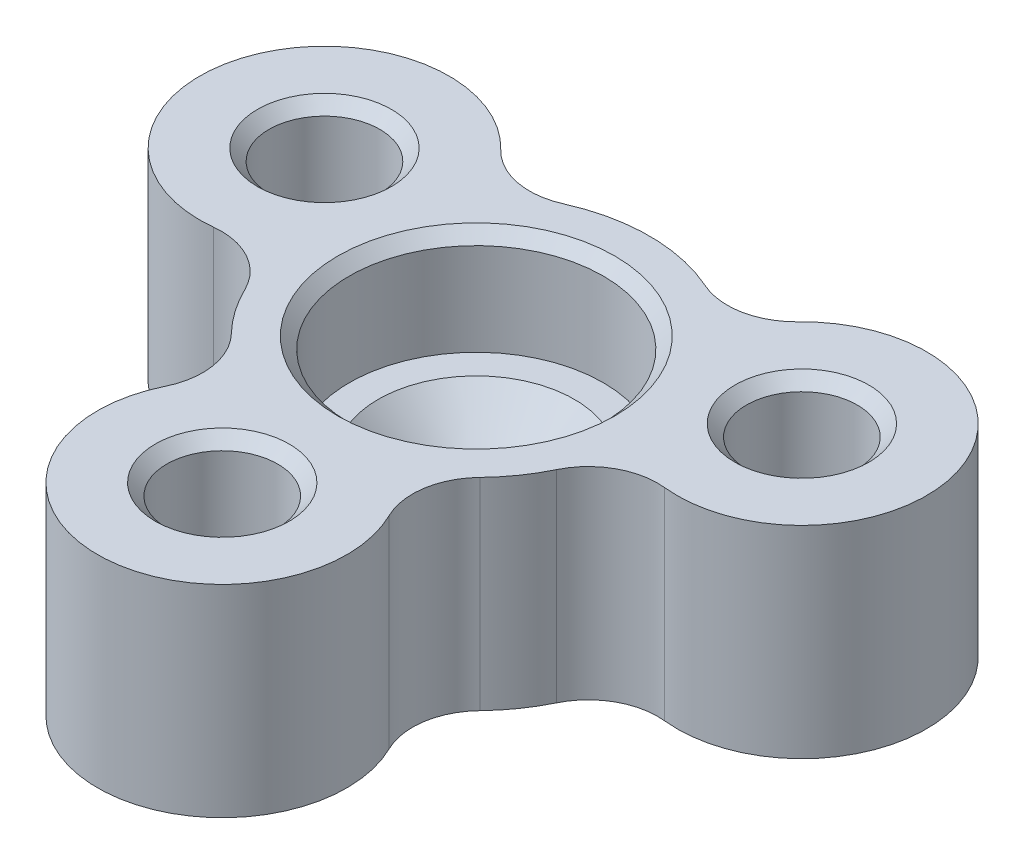
ISO-10303-21;
HEADER;
FILE_DESCRIPTION(('STEP AP214'),'2;1');
FILE_NAME('part.step','',(''),(''),'','','');
FILE_SCHEMA(('AUTOMOTIVE_DESIGN { 1 0 10303 214 1 1 1 1 }'));
ENDSEC;
DATA;
#1=APPLICATION_CONTEXT('core data for automotive mechanical design processes');
#2=APPLICATION_PROTOCOL_DEFINITION('international standard','automotive_design',2000,#1);
#3=PRODUCT_CONTEXT('',#1,'mechanical');
#4=PRODUCT('Part','Part','',(#3));
#5=PRODUCT_RELATED_PRODUCT_CATEGORY('part','',(#4));
#6=PRODUCT_DEFINITION_FORMATION('','',#4);
#7=PRODUCT_DEFINITION_CONTEXT('part definition',#1,'design');
#8=PRODUCT_DEFINITION('design','',#6,#7);
#9=PRODUCT_DEFINITION_SHAPE('','',#8);
#10=(LENGTH_UNIT() NAMED_UNIT(*) SI_UNIT(.MILLI.,.METRE.));
#11=(NAMED_UNIT(*) PLANE_ANGLE_UNIT() SI_UNIT($,.RADIAN.));
#12=(NAMED_UNIT(*) SI_UNIT($,.STERADIAN.) SOLID_ANGLE_UNIT());
#13=UNCERTAINTY_MEASURE_WITH_UNIT(LENGTH_MEASURE(1.E-05),#10,'distance_accuracy_value','');
#14=(GEOMETRIC_REPRESENTATION_CONTEXT(3) GLOBAL_UNCERTAINTY_ASSIGNED_CONTEXT((#13)) GLOBAL_UNIT_ASSIGNED_CONTEXT((#10,
#11,#12)) REPRESENTATION_CONTEXT('',''));
#15=CARTESIAN_POINT('',(0.,0.,0.));
#16=DIRECTION('',(0.,0.,1.));
#17=DIRECTION('',(1.,0.,0.));
#18=AXIS2_PLACEMENT_3D('',#15,#16,#17);
#19=CARTESIAN_POINT('',(0.,-8.74825,0.));
#20=DIRECTION('',(0.,1.,0.));
#21=DIRECTION('',(0.,0.,1.));
#22=AXIS2_PLACEMENT_3D('',#19,#20,#21);
#23=CYLINDRICAL_SURFACE('',#22,7.5);
#24=CARTESIAN_POINT('',(0.,0.,0.));
#25=DIRECTION('',(0.,1.,0.));
#26=DIRECTION('',(0.,0.,1.));
#27=AXIS2_PLACEMENT_3D('',#24,#25,#26);
#28=CIRCLE('',#27,7.5);
#29=CARTESIAN_POINT('',(5.38801845328376,0.,5.21720779220779));
#30=VERTEX_POINT('',#29);
#31=CARTESIAN_POINT('',(6.74538250707788,0.,3.27869102435832));
#32=VERTEX_POINT('',#31);
#33=EDGE_CURVE('E228',#30,#32,#28,.T.);
#34=ORIENTED_EDGE('',*,*,#33,.F.);
#35=DIRECTION('',(0.,1.,0.));
#36=VECTOR('',#35,1.);
#37=CARTESIAN_POINT('',(5.38801845328376,-8.74825,5.21720779220779));
#38=LINE('',#37,#36);
#39=CARTESIAN_POINT('',(5.38801845328376,-8.74825,5.21720779220779));
#40=VERTEX_POINT('',#39);
#41=EDGE_CURVE('E179',#30,#40,#38,.F.);
#42=ORIENTED_EDGE('',*,*,#41,.T.);
#43=CARTESIAN_POINT('',(0.,-8.74825,0.));
#44=DIRECTION('',(0.,1.,0.));
#45=DIRECTION('',(0.,0.,1.));
#46=AXIS2_PLACEMENT_3D('',#43,#44,#45);
#47=CIRCLE('',#46,7.5);
#48=CARTESIAN_POINT('',(6.74538250707788,-8.74825,3.27869102435832));
#49=VERTEX_POINT('',#48);
#50=EDGE_CURVE('E214',#40,#49,#47,.T.);
#51=ORIENTED_EDGE('',*,*,#50,.T.);
#52=DIRECTION('',(0.,1.,0.));
#53=VECTOR('',#52,1.);
#54=CARTESIAN_POINT('',(6.74538250707788,-8.74825,3.27869102435832));
#55=LINE('',#54,#53);
#56=EDGE_CURVE('E176',#49,#32,#55,.T.);
#57=ORIENTED_EDGE('',*,*,#56,.T.);
#58=EDGE_LOOP('',(#34,#42,#51,#57));
#59=FACE_BOUND('',#58,.T.);
#60=ADVANCED_FACE('F45',(#59),#23,.T.);
#61=CARTESIAN_POINT('',(0.,-8.74825,11.));
#62=DIRECTION('',(0.,1.,0.));
#63=DIRECTION('',(0.,0.,1.));
#64=AXIS2_PLACEMENT_3D('',#61,#62,#63);
#65=CYLINDRICAL_SURFACE('',#64,5.4);
#66=CARTESIAN_POINT('',(0.,0.,11.));
#67=DIRECTION('',(0.,1.,0.));
#68=DIRECTION('',(0.,0.,1.));
#69=AXIS2_PLACEMENT_3D('',#66,#67,#68);
#70=CIRCLE('',#69,5.4);
#71=CARTESIAN_POINT('',(-4.84921660795538,0.,8.62405844155844));
#72=VERTEX_POINT('',#71);
#73=CARTESIAN_POINT('',(4.84921660795538,0.,8.62405844155844));
#74=VERTEX_POINT('',#73);
#75=EDGE_CURVE('E159',#72,#74,#70,.T.);
#76=ORIENTED_EDGE('',*,*,#75,.F.);
#77=DIRECTION('',(0.,1.,0.));
#78=VECTOR('',#77,1.);
#79=CARTESIAN_POINT('',(-4.84921660795538,-8.74825,8.62405844155844));
#80=LINE('',#79,#78);
#81=CARTESIAN_POINT('',(-4.84921660795538,-8.74825,8.62405844155844));
#82=VERTEX_POINT('',#81);
#83=EDGE_CURVE('E174',#72,#82,#80,.F.);
#84=ORIENTED_EDGE('',*,*,#83,.T.);
#85=CARTESIAN_POINT('',(0.,-8.74825,11.));
#86=DIRECTION('',(0.,1.,0.));
#87=DIRECTION('',(0.,0.,1.));
#88=AXIS2_PLACEMENT_3D('',#85,#86,#87);
#89=CIRCLE('',#88,5.4);
#90=CARTESIAN_POINT('',(4.84921660795538,-8.74825,8.62405844155844));
#91=VERTEX_POINT('',#90);
#92=EDGE_CURVE('E257',#82,#91,#89,.T.);
#93=ORIENTED_EDGE('',*,*,#92,.T.);
#94=DIRECTION('',(0.,1.,0.));
#95=VECTOR('',#94,1.);
#96=CARTESIAN_POINT('',(4.84921660795538,-8.74825,8.62405844155844));
#97=LINE('',#96,#95);
#98=EDGE_CURVE('E165',#91,#74,#97,.T.);
#99=ORIENTED_EDGE('',*,*,#98,.T.);
#100=EDGE_LOOP('',(#76,#84,#93,#99));
#101=FACE_BOUND('',#100,.T.);
#102=ADVANCED_FACE('F290',(#101),#65,.T.);
#103=CARTESIAN_POINT('',(0.,-8.74825,0.));
#104=DIRECTION('',(0.,1.,0.));
#105=DIRECTION('',(0.,0.,1.));
#106=AXIS2_PLACEMENT_3D('',#103,#104,#105);
#107=CYLINDRICAL_SURFACE('',#106,7.5);
#108=CARTESIAN_POINT('',(0.,-8.74825,0.));
#109=DIRECTION('',(0.,1.,0.));
#110=DIRECTION('',(0.,0.,1.));
#111=AXIS2_PLACEMENT_3D('',#108,#109,#110);
#112=CIRCLE('',#111,7.5);
#113=CARTESIAN_POINT('',(-6.74538250707788,-8.74825,3.27869102435832));
#114=VERTEX_POINT('',#113);
#115=CARTESIAN_POINT('',(-5.38801845328376,-8.74825,5.21720779220779));
#116=VERTEX_POINT('',#115);
#117=EDGE_CURVE('E418',#114,#116,#112,.T.);
#118=ORIENTED_EDGE('',*,*,#117,.T.);
#119=DIRECTION('',(0.,1.,0.));
#120=VECTOR('',#119,1.);
#121=CARTESIAN_POINT('',(-5.38801845328376,-8.74825,5.21720779220779));
#122=LINE('',#121,#120);
#123=CARTESIAN_POINT('',(-5.38801845328376,0.,5.21720779220779));
#124=VERTEX_POINT('',#123);
#125=EDGE_CURVE('E158',#116,#124,#122,.T.);
#126=ORIENTED_EDGE('',*,*,#125,.T.);
#127=CARTESIAN_POINT('',(0.,0.,0.));
#128=DIRECTION('',(0.,1.,0.));
#129=DIRECTION('',(0.,0.,1.));
#130=AXIS2_PLACEMENT_3D('',#127,#128,#129);
#131=CIRCLE('',#130,7.5);
#132=CARTESIAN_POINT('',(-6.74538250707788,0.,3.27869102435832));
#133=VERTEX_POINT('',#132);
#134=EDGE_CURVE('E141',#133,#124,#131,.T.);
#135=ORIENTED_EDGE('',*,*,#134,.F.);
#136=DIRECTION('',(0.,1.,0.));
#137=VECTOR('',#136,1.);
#138=CARTESIAN_POINT('',(-6.74538250707788,-8.74825,3.27869102435832));
#139=LINE('',#138,#137);
#140=EDGE_CURVE('E155',#133,#114,#139,.F.);
#141=ORIENTED_EDGE('',*,*,#140,.T.);
#142=EDGE_LOOP('',(#118,#126,#135,#141));
#143=FACE_BOUND('',#142,.T.);
#144=ADVANCED_FACE('F154',(#143),#107,.T.);
#145=CARTESIAN_POINT('',(-10.336618828645,-8.74825,-3.7622215765824));
#146=DIRECTION('',(0.,1.,0.));
#147=DIRECTION('',(0.,0.,1.));
#148=AXIS2_PLACEMENT_3D('',#145,#146,#147);
#149=CYLINDRICAL_SURFACE('',#148,5.4);
#150=CARTESIAN_POINT('',(-10.336618828645,-8.74825,-3.7622215765824));
#151=DIRECTION('',(0.,1.,0.));
#152=DIRECTION('',(0.,0.,1.));
#153=AXIS2_PLACEMENT_3D('',#150,#151,#152);
#154=CIRCLE('',#153,5.4);
#155=CARTESIAN_POINT('',(-6.44543431948875,-8.74825,-7.50637476731893));
#156=VERTEX_POINT('',#155);
#157=CARTESIAN_POINT('',(-9.76249383802901,-8.74825,1.60717135885735));
#158=VERTEX_POINT('',#157);
#159=EDGE_CURVE('E412',#156,#158,#154,.T.);
#160=ORIENTED_EDGE('',*,*,#159,.T.);
#161=DIRECTION('',(0.,1.,0.));
#162=VECTOR('',#161,1.);
#163=CARTESIAN_POINT('',(-9.76249383802901,-8.74825,1.60717135885735));
#164=LINE('',#163,#162);
#165=CARTESIAN_POINT('',(-9.76249383802901,0.,1.60717135885735));
#166=VERTEX_POINT('',#165);
#167=EDGE_CURVE('E183',#158,#166,#164,.T.);
#168=ORIENTED_EDGE('',*,*,#167,.T.);
#169=CARTESIAN_POINT('',(-10.336618828645,0.,-3.7622215765824));
#170=DIRECTION('',(0.,1.,0.));
#171=DIRECTION('',(0.,0.,1.));
#172=AXIS2_PLACEMENT_3D('',#169,#170,#171);
#173=CIRCLE('',#172,5.4);
#174=CARTESIAN_POINT('',(-6.44543431948875,0.,-7.50637476731893));
#175=VERTEX_POINT('',#174);
#176=EDGE_CURVE('E143',#175,#166,#173,.T.);
#177=ORIENTED_EDGE('',*,*,#176,.F.);
#178=DIRECTION('',(0.,1.,0.));
#179=VECTOR('',#178,1.);
#180=CARTESIAN_POINT('',(-6.44543431948875,-8.74825,-7.50637476731893));
#181=LINE('',#180,#179);
#182=EDGE_CURVE('E181',#175,#156,#181,.F.);
#183=ORIENTED_EDGE('',*,*,#182,.T.);
#184=EDGE_LOOP('',(#160,#168,#177,#183));
#185=FACE_BOUND('',#184,.T.);
#186=ADVANCED_FACE('F399',(#185),#149,.T.);
#187=CARTESIAN_POINT('',(0.,-8.74825,0.));
#188=DIRECTION('',(0.,1.,0.));
#189=DIRECTION('',(0.,0.,1.));
#190=AXIS2_PLACEMENT_3D('',#187,#188,#189);
#191=CYLINDRICAL_SURFACE('',#190,7.5);
#192=CARTESIAN_POINT('',(0.,-8.74825,0.));
#193=DIRECTION('',(0.,1.,0.));
#194=DIRECTION('',(0.,0.,1.));
#195=AXIS2_PLACEMENT_3D('',#192,#193,#194);
#196=CIRCLE('',#195,7.5);
#197=CARTESIAN_POINT('',(3.05976081981091,-8.74825,-6.84747133805977));
#198=VERTEX_POINT('',#197);
#199=CARTESIAN_POINT('',(-3.05976081981092,-8.74825,-6.84747133805977));
#200=VERTEX_POINT('',#199);
#201=EDGE_CURVE('E408',#198,#200,#196,.T.);
#202=ORIENTED_EDGE('',*,*,#201,.T.);
#203=DIRECTION('',(0.,1.,0.));
#204=VECTOR('',#203,1.);
#205=CARTESIAN_POINT('',(-3.05976081981092,-8.74825,-6.84747133805977));
#206=LINE('',#205,#204);
#207=CARTESIAN_POINT('',(-3.05976081981092,0.,-6.84747133805977));
#208=VERTEX_POINT('',#207);
#209=EDGE_CURVE('E187',#200,#208,#206,.T.);
#210=ORIENTED_EDGE('',*,*,#209,.T.);
#211=CARTESIAN_POINT('',(0.,0.,0.));
#212=DIRECTION('',(0.,1.,0.));
#213=DIRECTION('',(0.,0.,1.));
#214=AXIS2_PLACEMENT_3D('',#211,#212,#213);
#215=CIRCLE('',#214,7.5);
#216=CARTESIAN_POINT('',(3.05976081981091,0.,-6.84747133805977));
#217=VERTEX_POINT('',#216);
#218=EDGE_CURVE('E231',#217,#208,#215,.T.);
#219=ORIENTED_EDGE('',*,*,#218,.F.);
#220=DIRECTION('',(0.,1.,0.));
#221=VECTOR('',#220,1.);
#222=CARTESIAN_POINT('',(3.05976081981091,-8.74825,-6.84747133805977));
#223=LINE('',#222,#221);
#224=EDGE_CURVE('E185',#217,#198,#223,.F.);
#225=ORIENTED_EDGE('',*,*,#224,.T.);
#226=EDGE_LOOP('',(#202,#210,#219,#225));
#227=FACE_BOUND('',#226,.T.);
#228=ADVANCED_FACE('F305',(#227),#191,.T.);
#229=CARTESIAN_POINT('',(10.336618828645,-8.74825,-3.7622215765824));
#230=DIRECTION('',(0.,1.,0.));
#231=DIRECTION('',(0.,0.,1.));
#232=AXIS2_PLACEMENT_3D('',#229,#230,#231);
#233=CYLINDRICAL_SURFACE('',#232,1.7);
#234=CARTESIAN_POINT('',(10.336618828645,-6.82060243331929,-3.7622215765824));
#235=DIRECTION('',(0.,1.,0.));
#236=DIRECTION('',(0.,0.,1.));
#237=AXIS2_PLACEMENT_3D('',#234,#235,#236);
#238=CIRCLE('',#237,1.7);
#239=CARTESIAN_POINT('',(10.336618828645,-6.82060243331929,-2.0622215765824));
#240=VERTEX_POINT('',#239);
#241=EDGE_CURVE('E245',#240,#240,#238,.T.);
#242=ORIENTED_EDGE('',*,*,#241,.T.);
#243=EDGE_LOOP('',(#242));
#244=FACE_BOUND('',#243,.T.);
#245=CARTESIAN_POINT('',(10.336618828645,-8.74825,-3.7622215765824));
#246=DIRECTION('',(0.,1.,0.));
#247=DIRECTION('',(0.,0.,1.));
#248=AXIS2_PLACEMENT_3D('',#245,#246,#247);
#249=CIRCLE('',#248,1.7);
#250=CARTESIAN_POINT('',(10.336618828645,-8.74825,-2.0622215765824));
#251=VERTEX_POINT('',#250);
#252=EDGE_CURVE('E223',#251,#251,#249,.T.);
#253=ORIENTED_EDGE('',*,*,#252,.F.);
#254=EDGE_LOOP('',(#253));
#255=FACE_BOUND('',#254,.T.);
#256=ADVANCED_FACE('F301',(#244,#255),#233,.F.);
#257=CARTESIAN_POINT('',(-10.336618828645,-8.74825,-3.7622215765824));
#258=DIRECTION('',(0.,1.,0.));
#259=DIRECTION('',(0.,0.,1.));
#260=AXIS2_PLACEMENT_3D('',#257,#258,#259);
#261=CYLINDRICAL_SURFACE('',#260,1.7);
#262=CARTESIAN_POINT('',(-10.336618828645,-6.82060243331929,-3.7622215765824));
#263=DIRECTION('',(0.,1.,0.));
#264=DIRECTION('',(0.,0.,1.));
#265=AXIS2_PLACEMENT_3D('',#262,#263,#264);
#266=CIRCLE('',#265,1.7);
#267=CARTESIAN_POINT('',(-10.336618828645,-6.82060243331929,-2.0622215765824));
#268=VERTEX_POINT('',#267);
#269=EDGE_CURVE('E249',#268,#268,#266,.T.);
#270=ORIENTED_EDGE('',*,*,#269,.T.);
#271=EDGE_LOOP('',(#270));
#272=FACE_BOUND('',#271,.T.);
#273=CARTESIAN_POINT('',(-10.336618828645,-8.74825,-3.7622215765824));
#274=DIRECTION('',(0.,1.,0.));
#275=DIRECTION('',(0.,0.,1.));
#276=AXIS2_PLACEMENT_3D('',#273,#274,#275);
#277=CIRCLE('',#276,1.7);
#278=CARTESIAN_POINT('',(-10.336618828645,-8.74825,-2.0622215765824));
#279=VERTEX_POINT('',#278);
#280=EDGE_CURVE('E431',#279,#279,#277,.T.);
#281=ORIENTED_EDGE('',*,*,#280,.F.);
#282=EDGE_LOOP('',(#281));
#283=FACE_BOUND('',#282,.T.);
#284=ADVANCED_FACE('F304',(#272,#283),#261,.F.);
#285=CARTESIAN_POINT('',(0.,-8.74825,11.));
#286=DIRECTION('',(0.,1.,0.));
#287=DIRECTION('',(0.,0.,1.));
#288=AXIS2_PLACEMENT_3D('',#285,#286,#287);
#289=CYLINDRICAL_SURFACE('',#288,1.7);
#290=CARTESIAN_POINT('',(0.,-6.82060243331929,11.));
#291=DIRECTION('',(0.,1.,0.));
#292=DIRECTION('',(0.,0.,1.));
#293=AXIS2_PLACEMENT_3D('',#290,#291,#292);
#294=CIRCLE('',#293,1.7);
#295=CARTESIAN_POINT('',(0.,-6.82060243331929,12.7));
#296=VERTEX_POINT('',#295);
#297=EDGE_CURVE('E235',#296,#296,#294,.T.);
#298=ORIENTED_EDGE('',*,*,#297,.T.);
#299=EDGE_LOOP('',(#298));
#300=FACE_BOUND('',#299,.T.);
#301=CARTESIAN_POINT('',(0.,-8.74825,11.));
#302=DIRECTION('',(0.,1.,0.));
#303=DIRECTION('',(0.,0.,1.));
#304=AXIS2_PLACEMENT_3D('',#301,#302,#303);
#305=CIRCLE('',#304,1.7);
#306=CARTESIAN_POINT('',(0.,-8.74825,12.7));
#307=VERTEX_POINT('',#306);
#308=EDGE_CURVE('E241',#307,#307,#305,.T.);
#309=ORIENTED_EDGE('',*,*,#308,.F.);
#310=EDGE_LOOP('',(#309));
#311=FACE_BOUND('',#310,.T.);
#312=ADVANCED_FACE('F309',(#300,#311),#289,.F.);
#313=CARTESIAN_POINT('',(10.336618828645,-8.74825,-3.7622215765824));
#314=DIRECTION('',(0.,1.,0.));
#315=DIRECTION('',(0.,0.,1.));
#316=AXIS2_PLACEMENT_3D('',#313,#314,#315);
#317=CYLINDRICAL_SURFACE('',#316,5.4);
#318=CARTESIAN_POINT('',(10.336618828645,-8.74825,-3.7622215765824));
#319=DIRECTION('',(0.,1.,0.));
#320=DIRECTION('',(0.,0.,1.));
#321=AXIS2_PLACEMENT_3D('',#318,#319,#320);
#322=CIRCLE('',#321,5.4);
#323=CARTESIAN_POINT('',(9.76249383802901,-8.74825,1.60717135885734));
#324=VERTEX_POINT('',#323);
#325=CARTESIAN_POINT('',(6.44543431948874,-8.74825,-7.50637476731894));
#326=VERTEX_POINT('',#325);
#327=EDGE_CURVE('E216',#324,#326,#322,.T.);
#328=ORIENTED_EDGE('',*,*,#327,.T.);
#329=DIRECTION('',(0.,1.,0.));
#330=VECTOR('',#329,1.);
#331=CARTESIAN_POINT('',(6.44543431948874,-8.74825,-7.50637476731894));
#332=LINE('',#331,#330);
#333=CARTESIAN_POINT('',(6.44543431948874,0.,-7.50637476731894));
#334=VERTEX_POINT('',#333);
#335=EDGE_CURVE('E191',#326,#334,#332,.T.);
#336=ORIENTED_EDGE('',*,*,#335,.T.);
#337=CARTESIAN_POINT('',(10.336618828645,0.,-3.7622215765824));
#338=DIRECTION('',(0.,1.,0.));
#339=DIRECTION('',(0.,0.,1.));
#340=AXIS2_PLACEMENT_3D('',#337,#338,#339);
#341=CIRCLE('',#340,5.4);
#342=CARTESIAN_POINT('',(9.76249383802901,0.,1.60717135885734));
#343=VERTEX_POINT('',#342);
#344=EDGE_CURVE('E227',#343,#334,#341,.T.);
#345=ORIENTED_EDGE('',*,*,#344,.F.);
#346=DIRECTION('',(0.,1.,0.));
#347=VECTOR('',#346,1.);
#348=CARTESIAN_POINT('',(9.76249383802901,-8.74825,1.60717135885734));
#349=LINE('',#348,#347);
#350=EDGE_CURVE('E68',#343,#324,#349,.F.);
#351=ORIENTED_EDGE('',*,*,#350,.T.);
#352=EDGE_LOOP('',(#328,#336,#345,#351));
#353=FACE_BOUND('',#352,.T.);
#354=ADVANCED_FACE('F229',(#353),#317,.T.);
#355=CARTESIAN_POINT('',(0.,-8.74825,0.));
#356=DIRECTION('',(0.,1.,0.));
#357=DIRECTION('',(0.,0.,1.));
#358=AXIS2_PLACEMENT_3D('',#355,#356,#357);
#359=PLANE('',#358);
#360=ORIENTED_EDGE('',*,*,#308,.T.);
#361=EDGE_LOOP('',(#360));
#362=FACE_BOUND('',#361,.T.);
#363=ORIENTED_EDGE('',*,*,#280,.T.);
#364=EDGE_LOOP('',(#363));
#365=FACE_BOUND('',#364,.T.);
#366=ORIENTED_EDGE('',*,*,#252,.T.);
#367=EDGE_LOOP('',(#366));
#368=FACE_BOUND('',#367,.T.);
#369=ORIENTED_EDGE('',*,*,#50,.F.);
#370=CARTESIAN_POINT('',(7.54322583459726,-8.74825,7.30409090909091));
#371=DIRECTION('',(0.,1.,0.));
#372=DIRECTION('',(0.,0.,1.));
#373=AXIS2_PLACEMENT_3D('',#370,#371,#372);
#374=CIRCLE('',#373,3.);
#375=EDGE_CURVE('E149',#40,#91,#374,.T.);
#376=ORIENTED_EDGE('',*,*,#375,.T.);
#377=ORIENTED_EDGE('',*,*,#92,.F.);
#378=CARTESIAN_POINT('',(-7.54322583459726,-8.74825,7.30409090909091));
#379=DIRECTION('',(0.,1.,0.));
#380=DIRECTION('',(0.,0.,1.));
#381=AXIS2_PLACEMENT_3D('',#378,#379,#380);
#382=CIRCLE('',#381,3.);
#383=EDGE_CURVE('E196',#82,#116,#382,.T.);
#384=ORIENTED_EDGE('',*,*,#383,.T.);
#385=ORIENTED_EDGE('',*,*,#117,.F.);
#386=CARTESIAN_POINT('',(-9.44353550990902,-8.74825,4.59016743410165));
#387=DIRECTION('',(0.,1.,0.));
#388=DIRECTION('',(0.,0.,1.));
#389=AXIS2_PLACEMENT_3D('',#386,#387,#388);
#390=CIRCLE('',#389,3.);
#391=EDGE_CURVE('E148',#114,#158,#390,.T.);
#392=ORIENTED_EDGE('',*,*,#391,.T.);
#393=ORIENTED_EDGE('',*,*,#159,.F.);
#394=CARTESIAN_POINT('',(-4.28366514773528,-8.74825,-9.58645987328367));
#395=DIRECTION('',(0.,1.,0.));
#396=DIRECTION('',(0.,0.,1.));
#397=AXIS2_PLACEMENT_3D('',#394,#395,#396);
#398=CIRCLE('',#397,3.);
#399=EDGE_CURVE('E204',#156,#200,#398,.T.);
#400=ORIENTED_EDGE('',*,*,#399,.T.);
#401=ORIENTED_EDGE('',*,*,#201,.F.);
#402=CARTESIAN_POINT('',(4.28366514773528,-8.74825,-9.58645987328368));
#403=DIRECTION('',(0.,1.,0.));
#404=DIRECTION('',(0.,0.,1.));
#405=AXIS2_PLACEMENT_3D('',#402,#403,#404);
#406=CIRCLE('',#405,3.);
#407=EDGE_CURVE('E61',#198,#326,#406,.T.);
#408=ORIENTED_EDGE('',*,*,#407,.T.);
#409=ORIENTED_EDGE('',*,*,#327,.F.);
#410=CARTESIAN_POINT('',(9.44353550990902,-8.74825,4.59016743410164));
#411=DIRECTION('',(0.,1.,0.));
#412=DIRECTION('',(0.,0.,1.));
#413=AXIS2_PLACEMENT_3D('',#410,#411,#412);
#414=CIRCLE('',#413,3.);
#415=EDGE_CURVE('E54',#324,#49,#414,.T.);
#416=ORIENTED_EDGE('',*,*,#415,.T.);
#417=EDGE_LOOP('',(#369,#376,#377,#384,#385,#392,#393,#400,#401,#408,#409,#416));
#418=FACE_BOUND('',#417,.T.);
#419=ADVANCED_FACE('F213',(#362,#365,#368,#418),#359,.F.);
#420=CARTESIAN_POINT('',(0.,0.,0.));
#421=DIRECTION('',(0.,1.,0.));
#422=DIRECTION('',(0.,0.,1.));
#423=AXIS2_PLACEMENT_3D('',#420,#421,#422);
#424=PLANE('',#423);
#425=CARTESIAN_POINT('',(0.,0.,0.));
#426=DIRECTION('',(0.,1.,0.));
#427=DIRECTION('',(0.,0.,1.));
#428=AXIS2_PLACEMENT_3D('',#425,#426,#427);
#429=CIRCLE('',#428,6.);
#430=CARTESIAN_POINT('',(0.,0.,6.));
#431=VERTEX_POINT('',#430);
#432=EDGE_CURVE('E442',#431,#431,#429,.T.);
#433=ORIENTED_EDGE('',*,*,#432,.F.);
#434=EDGE_LOOP('',(#433));
#435=FACE_BOUND('',#434,.T.);
#436=CARTESIAN_POINT('',(0.,0.,11.));
#437=DIRECTION('',(0.,1.,0.));
#438=DIRECTION('',(0.,0.,1.));
#439=AXIS2_PLACEMENT_3D('',#436,#437,#438);
#440=CIRCLE('',#439,2.89999999999999);
#441=CARTESIAN_POINT('',(0.,0.,13.9));
#442=VERTEX_POINT('',#441);
#443=EDGE_CURVE('E263',#442,#442,#440,.F.);
#444=ORIENTED_EDGE('',*,*,#443,.T.);
#445=EDGE_LOOP('',(#444));
#446=FACE_BOUND('',#445,.T.);
#447=CARTESIAN_POINT('',(10.336618828645,0.,-3.7622215765824));
#448=DIRECTION('',(0.,1.,0.));
#449=DIRECTION('',(0.,0.,1.));
#450=AXIS2_PLACEMENT_3D('',#447,#448,#449);
#451=CIRCLE('',#450,2.89999999999999);
#452=CARTESIAN_POINT('',(10.336618828645,0.,-0.862221576582414));
#453=VERTEX_POINT('',#452);
#454=EDGE_CURVE('E260',#453,#453,#451,.F.);
#455=ORIENTED_EDGE('',*,*,#454,.T.);
#456=EDGE_LOOP('',(#455));
#457=FACE_BOUND('',#456,.T.);
#458=CARTESIAN_POINT('',(-10.336618828645,0.,-3.7622215765824));
#459=DIRECTION('',(0.,1.,0.));
#460=DIRECTION('',(0.,0.,1.));
#461=AXIS2_PLACEMENT_3D('',#458,#459,#460);
#462=CIRCLE('',#461,2.89999999999999);
#463=CARTESIAN_POINT('',(-10.336618828645,0.,-0.862221576582405));
#464=VERTEX_POINT('',#463);
#465=EDGE_CURVE('E256',#464,#464,#462,.F.);
#466=ORIENTED_EDGE('',*,*,#465,.T.);
#467=EDGE_LOOP('',(#466));
#468=FACE_BOUND('',#467,.T.);
#469=ORIENTED_EDGE('',*,*,#75,.T.);
#470=CARTESIAN_POINT('',(7.54322583459726,0.,7.30409090909091));
#471=DIRECTION('',(0.,1.,0.));
#472=DIRECTION('',(0.,0.,1.));
#473=AXIS2_PLACEMENT_3D('',#470,#471,#472);
#474=CIRCLE('',#473,3.);
#475=EDGE_CURVE('E198',#74,#30,#474,.F.);
#476=ORIENTED_EDGE('',*,*,#475,.T.);
#477=ORIENTED_EDGE('',*,*,#33,.T.);
#478=CARTESIAN_POINT('',(9.44353550990902,0.,4.59016743410164));
#479=DIRECTION('',(0.,1.,0.));
#480=DIRECTION('',(0.,0.,1.));
#481=AXIS2_PLACEMENT_3D('',#478,#479,#480);
#482=CIRCLE('',#481,3.);
#483=EDGE_CURVE('E209',#32,#343,#482,.F.);
#484=ORIENTED_EDGE('',*,*,#483,.T.);
#485=ORIENTED_EDGE('',*,*,#344,.T.);
#486=CARTESIAN_POINT('',(4.28366514773528,0.,-9.58645987328368));
#487=DIRECTION('',(0.,1.,0.));
#488=DIRECTION('',(0.,0.,1.));
#489=AXIS2_PLACEMENT_3D('',#486,#487,#488);
#490=CIRCLE('',#489,3.);
#491=EDGE_CURVE('E206',#334,#217,#490,.F.);
#492=ORIENTED_EDGE('',*,*,#491,.T.);
#493=ORIENTED_EDGE('',*,*,#218,.T.);
#494=CARTESIAN_POINT('',(-4.28366514773528,0.,-9.58645987328367));
#495=DIRECTION('',(0.,1.,0.));
#496=DIRECTION('',(0.,0.,1.));
#497=AXIS2_PLACEMENT_3D('',#494,#495,#496);
#498=CIRCLE('',#497,3.);
#499=EDGE_CURVE('E202',#208,#175,#498,.F.);
#500=ORIENTED_EDGE('',*,*,#499,.T.);
#501=ORIENTED_EDGE('',*,*,#176,.T.);
#502=CARTESIAN_POINT('',(-9.44353550990902,0.,4.59016743410165));
#503=DIRECTION('',(0.,1.,0.));
#504=DIRECTION('',(0.,0.,1.));
#505=AXIS2_PLACEMENT_3D('',#502,#503,#504);
#506=CIRCLE('',#505,3.);
#507=EDGE_CURVE('E137',#166,#133,#506,.F.);
#508=ORIENTED_EDGE('',*,*,#507,.T.);
#509=ORIENTED_EDGE('',*,*,#134,.T.);
#510=CARTESIAN_POINT('',(-7.54322583459726,0.,7.30409090909091));
#511=DIRECTION('',(0.,1.,0.));
#512=DIRECTION('',(0.,0.,1.));
#513=AXIS2_PLACEMENT_3D('',#510,#511,#512);
#514=CIRCLE('',#513,3.);
#515=EDGE_CURVE('E194',#124,#72,#514,.F.);
#516=ORIENTED_EDGE('',*,*,#515,.T.);
#517=EDGE_LOOP('',(#469,#476,#477,#484,#485,#492,#493,#500,#501,#508,#509,#516));
#518=FACE_BOUND('',#517,.T.);
#519=ADVANCED_FACE('F140',(#435,#446,#457,#468,#518),#424,.T.);
#520=CARTESIAN_POINT('',(0.,-6.4,11.));
#521=DIRECTION('',(0.,1.,0.));
#522=DIRECTION('',(0.,0.,1.));
#523=AXIS2_PLACEMENT_3D('',#520,#521,#522);
#524=CONICAL_SURFACE('',#523,2.4,1.02974425867665);
#525=CARTESIAN_POINT('',(0.,-6.4,11.));
#526=DIRECTION('',(0.,1.,0.));
#527=DIRECTION('',(0.,0.,1.));
#528=AXIS2_PLACEMENT_3D('',#525,#526,#527);
#529=CIRCLE('',#528,2.4);
#530=CARTESIAN_POINT('',(0.,-6.4,13.4));
#531=VERTEX_POINT('',#530);
#532=EDGE_CURVE('E244',#531,#531,#529,.T.);
#533=ORIENTED_EDGE('',*,*,#532,.T.);
#534=EDGE_LOOP('',(#533));
#535=FACE_BOUND('',#534,.T.);
#536=ORIENTED_EDGE('',*,*,#297,.F.);
#537=EDGE_LOOP('',(#536));
#538=FACE_BOUND('',#537,.T.);
#539=ADVANCED_FACE('F386',(#535,#538),#524,.F.);
#540=CARTESIAN_POINT('',(0.,0.,11.));
#541=DIRECTION('',(0.,1.,0.));
#542=DIRECTION('',(0.,0.,1.));
#543=AXIS2_PLACEMENT_3D('',#540,#541,#542);
#544=CYLINDRICAL_SURFACE('',#543,2.39999999999999);
#545=CARTESIAN_POINT('',(0.,-0.499999999999987,11.));
#546=DIRECTION('',(0.,1.,0.));
#547=DIRECTION('',(0.,0.,1.));
#548=AXIS2_PLACEMENT_3D('',#545,#546,#547);
#549=CIRCLE('',#548,2.39999999999999);
#550=CARTESIAN_POINT('',(0.,-0.499999999999987,13.4));
#551=VERTEX_POINT('',#550);
#552=EDGE_CURVE('E253',#551,#551,#549,.T.);
#553=ORIENTED_EDGE('',*,*,#552,.T.);
#554=EDGE_LOOP('',(#553));
#555=FACE_BOUND('',#554,.T.);
#556=ORIENTED_EDGE('',*,*,#532,.F.);
#557=EDGE_LOOP('',(#556));
#558=FACE_BOUND('',#557,.T.);
#559=ADVANCED_FACE('F382',(#555,#558),#544,.F.);
#560=CARTESIAN_POINT('',(10.336618828645,-6.4,-3.7622215765824));
#561=DIRECTION('',(0.,1.,0.));
#562=DIRECTION('',(0.,0.,1.));
#563=AXIS2_PLACEMENT_3D('',#560,#561,#562);
#564=CONICAL_SURFACE('',#563,2.4,1.02974425867665);
#565=CARTESIAN_POINT('',(10.336618828645,-6.4,-3.7622215765824));
#566=DIRECTION('',(0.,1.,0.));
#567=DIRECTION('',(0.,0.,1.));
#568=AXIS2_PLACEMENT_3D('',#565,#566,#567);
#569=CIRCLE('',#568,2.4);
#570=CARTESIAN_POINT('',(10.336618828645,-6.4,-1.3622215765824));
#571=VERTEX_POINT('',#570);
#572=EDGE_CURVE('E248',#571,#571,#569,.T.);
#573=ORIENTED_EDGE('',*,*,#572,.T.);
#574=EDGE_LOOP('',(#573));
#575=FACE_BOUND('',#574,.T.);
#576=ORIENTED_EDGE('',*,*,#241,.F.);
#577=EDGE_LOOP('',(#576));
#578=FACE_BOUND('',#577,.T.);
#579=ADVANCED_FACE('F379',(#575,#578),#564,.F.);
#580=CARTESIAN_POINT('',(10.336618828645,0.,-3.7622215765824));
#581=DIRECTION('',(0.,1.,0.));
#582=DIRECTION('',(0.,0.,1.));
#583=AXIS2_PLACEMENT_3D('',#580,#581,#582);
#584=CYLINDRICAL_SURFACE('',#583,2.39999999999999);
#585=CARTESIAN_POINT('',(10.336618828645,-0.499999999999987,-3.7622215765824));
#586=DIRECTION('',(0.,1.,0.));
#587=DIRECTION('',(0.,0.,1.));
#588=AXIS2_PLACEMENT_3D('',#585,#586,#587);
#589=CIRCLE('',#588,2.39999999999999);
#590=CARTESIAN_POINT('',(10.336618828645,-0.499999999999987,-1.36222157658241));
#591=VERTEX_POINT('',#590);
#592=EDGE_CURVE('E168',#591,#591,#589,.T.);
#593=ORIENTED_EDGE('',*,*,#592,.T.);
#594=EDGE_LOOP('',(#593));
#595=FACE_BOUND('',#594,.T.);
#596=ORIENTED_EDGE('',*,*,#572,.F.);
#597=EDGE_LOOP('',(#596));
#598=FACE_BOUND('',#597,.T.);
#599=ADVANCED_FACE('F268',(#595,#598),#584,.F.);
#600=CARTESIAN_POINT('',(-10.336618828645,-6.4,-3.7622215765824));
#601=DIRECTION('',(0.,1.,0.));
#602=DIRECTION('',(0.,0.,1.));
#603=AXIS2_PLACEMENT_3D('',#600,#601,#602);
#604=CONICAL_SURFACE('',#603,2.4,1.02974425867665);
#605=CARTESIAN_POINT('',(-10.336618828645,-6.4,-3.7622215765824));
#606=DIRECTION('',(0.,1.,0.));
#607=DIRECTION('',(0.,0.,1.));
#608=AXIS2_PLACEMENT_3D('',#605,#606,#607);
#609=CIRCLE('',#608,2.4);
#610=CARTESIAN_POINT('',(-10.336618828645,-6.4,-1.3622215765824));
#611=VERTEX_POINT('',#610);
#612=EDGE_CURVE('E252',#611,#611,#609,.T.);
#613=ORIENTED_EDGE('',*,*,#612,.T.);
#614=EDGE_LOOP('',(#613));
#615=FACE_BOUND('',#614,.T.);
#616=ORIENTED_EDGE('',*,*,#269,.F.);
#617=EDGE_LOOP('',(#616));
#618=FACE_BOUND('',#617,.T.);
#619=ADVANCED_FACE('F372',(#615,#618),#604,.F.);
#620=CARTESIAN_POINT('',(-10.336618828645,0.,-3.7622215765824));
#621=DIRECTION('',(0.,1.,0.));
#622=DIRECTION('',(0.,0.,1.));
#623=AXIS2_PLACEMENT_3D('',#620,#621,#622);
#624=CYLINDRICAL_SURFACE('',#623,2.39999999999999);
#625=CARTESIAN_POINT('',(-10.336618828645,-0.499999999999994,-3.7622215765824));
#626=DIRECTION('',(0.,1.,0.));
#627=DIRECTION('',(0.,0.,1.));
#628=AXIS2_PLACEMENT_3D('',#625,#626,#627);
#629=CIRCLE('',#628,2.39999999999999);
#630=CARTESIAN_POINT('',(-10.336618828645,-0.499999999999994,-1.3622215765824));
#631=VERTEX_POINT('',#630);
#632=EDGE_CURVE('E163',#631,#631,#629,.T.);
#633=ORIENTED_EDGE('',*,*,#632,.T.);
#634=EDGE_LOOP('',(#633));
#635=FACE_BOUND('',#634,.T.);
#636=ORIENTED_EDGE('',*,*,#612,.F.);
#637=EDGE_LOOP('',(#636));
#638=FACE_BOUND('',#637,.T.);
#639=ADVANCED_FACE('F284',(#635,#638),#624,.F.);
#640=CARTESIAN_POINT('',(0.,-0.499999999999987,11.));
#641=DIRECTION('',(0.,1.,0.));
#642=DIRECTION('',(0.,0.,1.));
#643=AXIS2_PLACEMENT_3D('',#640,#641,#642);
#644=CONICAL_SURFACE('',#643,2.39999999999999,0.785398163397453);
#645=ORIENTED_EDGE('',*,*,#443,.F.);
#646=EDGE_LOOP('',(#645));
#647=FACE_BOUND('',#646,.T.);
#648=ORIENTED_EDGE('',*,*,#552,.F.);
#649=EDGE_LOOP('',(#648));
#650=FACE_BOUND('',#649,.T.);
#651=ADVANCED_FACE('F274',(#647,#650),#644,.F.);
#652=CARTESIAN_POINT('',(10.336618828645,-0.499999999999987,-3.7622215765824));
#653=DIRECTION('',(0.,1.,0.));
#654=DIRECTION('',(0.,0.,1.));
#655=AXIS2_PLACEMENT_3D('',#652,#653,#654);
#656=CONICAL_SURFACE('',#655,2.39999999999999,0.785398163397454);
#657=ORIENTED_EDGE('',*,*,#454,.F.);
#658=EDGE_LOOP('',(#657));
#659=FACE_BOUND('',#658,.T.);
#660=ORIENTED_EDGE('',*,*,#592,.F.);
#661=EDGE_LOOP('',(#660));
#662=FACE_BOUND('',#661,.T.);
#663=ADVANCED_FACE('F271',(#659,#662),#656,.F.);
#664=CARTESIAN_POINT('',(-10.336618828645,-0.499999999999994,-3.7622215765824));
#665=DIRECTION('',(0.,1.,0.));
#666=DIRECTION('',(0.,0.,1.));
#667=AXIS2_PLACEMENT_3D('',#664,#665,#666);
#668=CONICAL_SURFACE('',#667,2.39999999999999,0.785398163397453);
#669=ORIENTED_EDGE('',*,*,#465,.F.);
#670=EDGE_LOOP('',(#669));
#671=FACE_BOUND('',#670,.T.);
#672=ORIENTED_EDGE('',*,*,#632,.F.);
#673=EDGE_LOOP('',(#672));
#674=FACE_BOUND('',#673,.T.);
#675=ADVANCED_FACE('F273',(#671,#674),#668,.F.);
#676=CARTESIAN_POINT('',(0.,-0.500000000000002,0.));
#677=DIRECTION('',(0.,1.,0.));
#678=DIRECTION('',(0.,0.,1.));
#679=AXIS2_PLACEMENT_3D('',#676,#677,#678);
#680=CONICAL_SURFACE('',#679,5.5,0.785398163397447);
#681=ORIENTED_EDGE('',*,*,#432,.T.);
#682=EDGE_LOOP('',(#681));
#683=FACE_BOUND('',#682,.T.);
#684=CARTESIAN_POINT('',(0.,-0.500000000000002,0.));
#685=DIRECTION('',(0.,1.,0.));
#686=DIRECTION('',(0.,0.,1.));
#687=AXIS2_PLACEMENT_3D('',#684,#685,#686);
#688=CIRCLE('',#687,5.5);
#689=CARTESIAN_POINT('',(0.,-0.500000000000002,5.5));
#690=VERTEX_POINT('',#689);
#691=EDGE_CURVE('E445',#690,#690,#688,.T.);
#692=ORIENTED_EDGE('',*,*,#691,.F.);
#693=EDGE_LOOP('',(#692));
#694=FACE_BOUND('',#693,.T.);
#695=ADVANCED_FACE('F281',(#683,#694),#680,.F.);
#696=CARTESIAN_POINT('',(0.,1.69902051950314,0.));
#697=DIRECTION('',(0.,1.,0.));
#698=DIRECTION('',(0.,0.,1.));
#699=AXIS2_PLACEMENT_3D('',#696,#697,#698);
#700=CYLINDRICAL_SURFACE('',#699,5.5);
#701=ORIENTED_EDGE('',*,*,#691,.T.);
#702=EDGE_LOOP('',(#701));
#703=FACE_BOUND('',#702,.T.);
#704=CARTESIAN_POINT('',(0.,-4.5,0.));
#705=DIRECTION('',(0.,1.,0.));
#706=DIRECTION('',(0.,0.,1.));
#707=AXIS2_PLACEMENT_3D('',#704,#705,#706);
#708=CIRCLE('',#707,5.5);
#709=CARTESIAN_POINT('',(0.,-4.5,5.5));
#710=VERTEX_POINT('',#709);
#711=EDGE_CURVE('E448',#710,#710,#708,.T.);
#712=ORIENTED_EDGE('',*,*,#711,.F.);
#713=EDGE_LOOP('',(#712));
#714=FACE_BOUND('',#713,.T.);
#715=ADVANCED_FACE('F360',(#703,#714),#700,.F.);
#716=CARTESIAN_POINT('',(0.,-4.5,-5.5));
#717=DIRECTION('',(0.,1.,0.));
#718=DIRECTION('',(0.,0.,1.));
#719=AXIS2_PLACEMENT_3D('',#716,#717,#718);
#720=PLANE('',#719);
#721=ORIENTED_EDGE('',*,*,#711,.T.);
#722=EDGE_LOOP('',(#721));
#723=FACE_BOUND('',#722,.T.);
#724=CARTESIAN_POINT('',(0.,-4.5,0.));
#725=DIRECTION('',(0.,1.,0.));
#726=DIRECTION('',(0.,0.,1.));
#727=AXIS2_PLACEMENT_3D('',#724,#725,#726);
#728=CIRCLE('',#727,4.25);
#729=CARTESIAN_POINT('',(0.,-4.5,4.25));
#730=VERTEX_POINT('',#729);
#731=EDGE_CURVE('E353',#730,#730,#728,.T.);
#732=ORIENTED_EDGE('',*,*,#731,.F.);
#733=EDGE_LOOP('',(#732));
#734=FACE_BOUND('',#733,.T.);
#735=ADVANCED_FACE('F356',(#723,#734),#720,.T.);
#736=CARTESIAN_POINT('',(0.,-6.5,-4.25));
#737=DIRECTION('',(0.,1.,0.));
#738=DIRECTION('',(0.,0.,1.));
#739=AXIS2_PLACEMENT_3D('',#736,#737,#738);
#740=PLANE('',#739);
#741=CARTESIAN_POINT('',(0.,-6.5,0.));
#742=DIRECTION('',(0.,1.,0.));
#743=DIRECTION('',(0.,0.,1.));
#744=AXIS2_PLACEMENT_3D('',#741,#742,#743);
#745=CIRCLE('',#744,2.25000000000001);
#746=CARTESIAN_POINT('',(0.,-6.5,2.25000000000001));
#747=VERTEX_POINT('',#746);
#748=EDGE_CURVE('E11',#747,#747,#745,.T.);
#749=ORIENTED_EDGE('',*,*,#748,.T.);
#750=EDGE_LOOP('',(#749));
#751=FACE_BOUND('',#750,.T.);
#752=ADVANCED_FACE('F328',(#751),#740,.T.);
#753=CARTESIAN_POINT('',(-7.54322583459726,-8.74825,7.30409090909091));
#754=DIRECTION('',(0.,-1.,0.));
#755=DIRECTION('',(0.,0.,-1.));
#756=AXIS2_PLACEMENT_3D('',#753,#754,#755);
#757=CYLINDRICAL_SURFACE('',#756,3.);
#758=ORIENTED_EDGE('',*,*,#383,.F.);
#759=ORIENTED_EDGE('',*,*,#83,.F.);
#760=ORIENTED_EDGE('',*,*,#515,.F.);
#761=ORIENTED_EDGE('',*,*,#125,.F.);
#762=EDGE_LOOP('',(#758,#759,#760,#761));
#763=FACE_BOUND('',#762,.T.);
#764=ADVANCED_FACE('F324',(#763),#757,.F.);
#765=CARTESIAN_POINT('',(7.54322583459726,-8.74825,7.30409090909091));
#766=DIRECTION('',(0.,-1.,0.));
#767=DIRECTION('',(0.,0.,-1.));
#768=AXIS2_PLACEMENT_3D('',#765,#766,#767);
#769=CYLINDRICAL_SURFACE('',#768,3.);
#770=ORIENTED_EDGE('',*,*,#375,.F.);
#771=ORIENTED_EDGE('',*,*,#41,.F.);
#772=ORIENTED_EDGE('',*,*,#475,.F.);
#773=ORIENTED_EDGE('',*,*,#98,.F.);
#774=EDGE_LOOP('',(#770,#771,#772,#773));
#775=FACE_BOUND('',#774,.T.);
#776=ADVANCED_FACE('F327',(#775),#769,.F.);
#777=CARTESIAN_POINT('',(-9.44353550990902,-8.74825,4.59016743410165));
#778=DIRECTION('',(0.,-1.,0.));
#779=DIRECTION('',(0.,0.,-1.));
#780=AXIS2_PLACEMENT_3D('',#777,#778,#779);
#781=CYLINDRICAL_SURFACE('',#780,3.);
#782=ORIENTED_EDGE('',*,*,#391,.F.);
#783=ORIENTED_EDGE('',*,*,#140,.F.);
#784=ORIENTED_EDGE('',*,*,#507,.F.);
#785=ORIENTED_EDGE('',*,*,#167,.F.);
#786=EDGE_LOOP('',(#782,#783,#784,#785));
#787=FACE_BOUND('',#786,.T.);
#788=ADVANCED_FACE('F162',(#787),#781,.F.);
#789=CARTESIAN_POINT('',(-4.28366514773528,-8.74825,-9.58645987328367));
#790=DIRECTION('',(0.,-1.,0.));
#791=DIRECTION('',(0.,0.,-1.));
#792=AXIS2_PLACEMENT_3D('',#789,#790,#791);
#793=CYLINDRICAL_SURFACE('',#792,3.);
#794=ORIENTED_EDGE('',*,*,#399,.F.);
#795=ORIENTED_EDGE('',*,*,#182,.F.);
#796=ORIENTED_EDGE('',*,*,#499,.F.);
#797=ORIENTED_EDGE('',*,*,#209,.F.);
#798=EDGE_LOOP('',(#794,#795,#796,#797));
#799=FACE_BOUND('',#798,.T.);
#800=ADVANCED_FACE('F335',(#799),#793,.F.);
#801=CARTESIAN_POINT('',(4.28366514773528,-8.74825,-9.58645987328368));
#802=DIRECTION('',(0.,-1.,0.));
#803=DIRECTION('',(0.,0.,-1.));
#804=AXIS2_PLACEMENT_3D('',#801,#802,#803);
#805=CYLINDRICAL_SURFACE('',#804,3.);
#806=ORIENTED_EDGE('',*,*,#407,.F.);
#807=ORIENTED_EDGE('',*,*,#224,.F.);
#808=ORIENTED_EDGE('',*,*,#491,.F.);
#809=ORIENTED_EDGE('',*,*,#335,.F.);
#810=EDGE_LOOP('',(#806,#807,#808,#809));
#811=FACE_BOUND('',#810,.T.);
#812=ADVANCED_FACE('F338',(#811),#805,.F.);
#813=CARTESIAN_POINT('',(9.44353550990902,-8.74825,4.59016743410164));
#814=DIRECTION('',(0.,-1.,0.));
#815=DIRECTION('',(0.,0.,-1.));
#816=AXIS2_PLACEMENT_3D('',#813,#814,#815);
#817=CYLINDRICAL_SURFACE('',#816,3.);
#818=ORIENTED_EDGE('',*,*,#415,.F.);
#819=ORIENTED_EDGE('',*,*,#350,.F.);
#820=ORIENTED_EDGE('',*,*,#483,.F.);
#821=ORIENTED_EDGE('',*,*,#56,.F.);
#822=EDGE_LOOP('',(#818,#819,#820,#821));
#823=FACE_BOUND('',#822,.T.);
#824=ADVANCED_FACE('F225',(#823),#817,.F.);
#825=CARTESIAN_POINT('',(0.,-6.5,0.));
#826=DIRECTION('',(0.,1.,0.));
#827=DIRECTION('',(0.,0.,1.));
#828=AXIS2_PLACEMENT_3D('',#825,#826,#827);
#829=CONICAL_SURFACE('',#828,2.25000000000001,0.785398163397452);
#830=ORIENTED_EDGE('',*,*,#731,.T.);
#831=EDGE_LOOP('',(#830));
#832=FACE_BOUND('',#831,.T.);
#833=ORIENTED_EDGE('',*,*,#748,.F.);
#834=EDGE_LOOP('',(#833));
#835=FACE_BOUND('',#834,.T.);
#836=ADVANCED_FACE('F48',(#832,#835),#829,.F.);
#837=CLOSED_SHELL('',(#60,#102,#144,#186,#228,#256,#284,#312,#354,#419,#519,#539,#559,#579,#599,
#619,#639,#651,#663,#675,#695,#715,#735,#752,#764,#776,#788,#800,#812,#824,#836));
#838=MANIFOLD_SOLID_BREP('B2',#837);
#839=ADVANCED_BREP_SHAPE_REPRESENTATION('',(#18,#838),#14);
#840=SHAPE_DEFINITION_REPRESENTATION(#9,#839);
ENDSEC;
END-ISO-10303-21;
